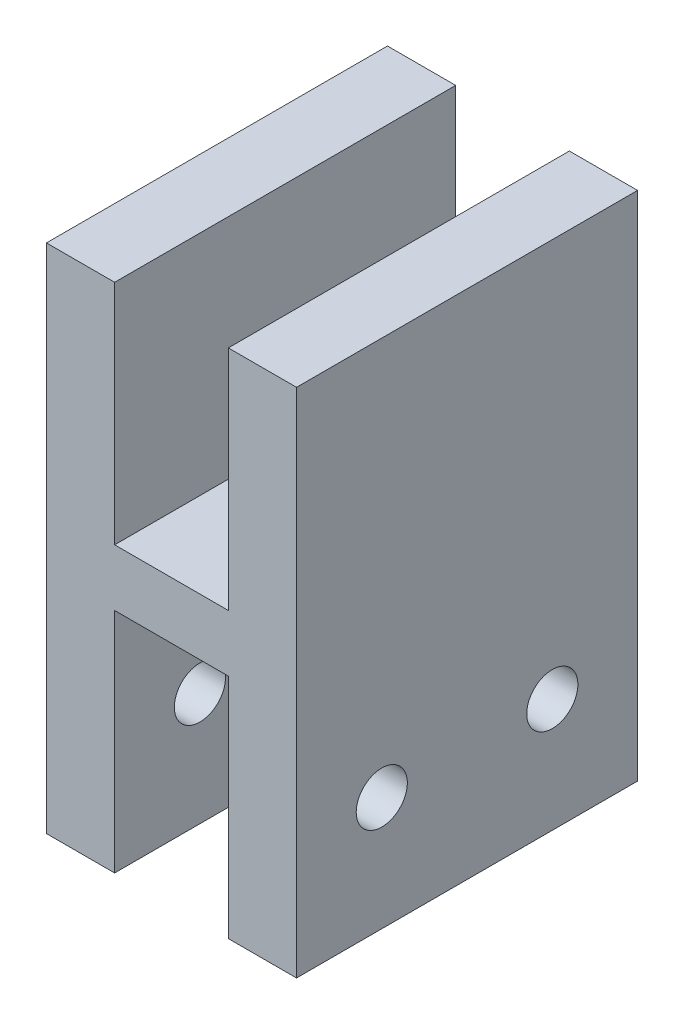
ISO-10303-21;
HEADER;
FILE_DESCRIPTION(('STEP AP214'),'2;1');
FILE_NAME('part.step','',(''),(''),'','','');
FILE_SCHEMA(('AUTOMOTIVE_DESIGN { 1 0 10303 214 1 1 1 1 }'));
ENDSEC;
DATA;
#1=APPLICATION_CONTEXT('core data for automotive mechanical design processes');
#2=APPLICATION_PROTOCOL_DEFINITION('international standard','automotive_design',2000,#1);
#3=PRODUCT_CONTEXT('',#1,'mechanical');
#4=PRODUCT('Part','Part','',(#3));
#5=PRODUCT_RELATED_PRODUCT_CATEGORY('part','',(#4));
#6=PRODUCT_DEFINITION_FORMATION('','',#4);
#7=PRODUCT_DEFINITION_CONTEXT('part definition',#1,'design');
#8=PRODUCT_DEFINITION('design','',#6,#7);
#9=PRODUCT_DEFINITION_SHAPE('','',#8);
#10=(LENGTH_UNIT() NAMED_UNIT(*) SI_UNIT(.MILLI.,.METRE.));
#11=(NAMED_UNIT(*) PLANE_ANGLE_UNIT() SI_UNIT($,.RADIAN.));
#12=(NAMED_UNIT(*) SI_UNIT($,.STERADIAN.) SOLID_ANGLE_UNIT());
#13=UNCERTAINTY_MEASURE_WITH_UNIT(LENGTH_MEASURE(1.E-05),#10,'distance_accuracy_value','');
#14=(GEOMETRIC_REPRESENTATION_CONTEXT(3) GLOBAL_UNCERTAINTY_ASSIGNED_CONTEXT((#13)) GLOBAL_UNIT_ASSIGNED_CONTEXT((#10,
#11,#12)) REPRESENTATION_CONTEXT('',''));
#15=CARTESIAN_POINT('',(0.,0.,0.));
#16=DIRECTION('',(0.,0.,1.));
#17=DIRECTION('',(1.,0.,0.));
#18=AXIS2_PLACEMENT_3D('',#15,#16,#17);
#19=CARTESIAN_POINT('',(-5.,20.,30.));
#20=DIRECTION('',(0.,-1.,0.));
#21=DIRECTION('',(1.,0.,0.));
#22=AXIS2_PLACEMENT_3D('',#19,#20,#21);
#23=PLANE('',#22);
#24=DIRECTION('',(-1.,0.,0.));
#25=VECTOR('',#24,1.);
#26=CARTESIAN_POINT('',(-5.,20.,0.));
#27=LINE('',#26,#25);
#28=CARTESIAN_POINT('',(-5.,20.,0.));
#29=VERTEX_POINT('',#28);
#30=CARTESIAN_POINT('',(-11.,20.,0.));
#31=VERTEX_POINT('',#30);
#32=EDGE_CURVE('E159',#29,#31,#27,.T.);
#33=ORIENTED_EDGE('',*,*,#32,.T.);
#34=DIRECTION('',(0.,0.,-1.));
#35=VECTOR('',#34,1.);
#36=CARTESIAN_POINT('',(-11.,20.,30.));
#37=LINE('',#36,#35);
#38=CARTESIAN_POINT('',(-11.,20.,30.));
#39=VERTEX_POINT('',#38);
#40=EDGE_CURVE('E11',#39,#31,#37,.T.);
#41=ORIENTED_EDGE('',*,*,#40,.F.);
#42=DIRECTION('',(-1.,0.,0.));
#43=VECTOR('',#42,1.);
#44=CARTESIAN_POINT('',(-5.,20.,30.));
#45=LINE('',#44,#43);
#46=CARTESIAN_POINT('',(-5.,20.,30.));
#47=VERTEX_POINT('',#46);
#48=EDGE_CURVE('E182',#47,#39,#45,.T.);
#49=ORIENTED_EDGE('',*,*,#48,.F.);
#50=DIRECTION('',(0.,0.,-1.));
#51=VECTOR('',#50,1.);
#52=CARTESIAN_POINT('',(-5.,20.,30.));
#53=LINE('',#52,#51);
#54=EDGE_CURVE('E155',#47,#29,#53,.T.);
#55=ORIENTED_EDGE('',*,*,#54,.T.);
#56=EDGE_LOOP('',(#33,#41,#49,#55));
#57=FACE_BOUND('',#56,.T.);
#58=ADVANCED_FACE('F37',(#57),#23,.F.);
#59=CARTESIAN_POINT('',(-11.,-25.,30.));
#60=DIRECTION('',(1.,0.,0.));
#61=DIRECTION('',(0.,1.,0.));
#62=AXIS2_PLACEMENT_3D('',#59,#60,#61);
#63=PLANE('',#62);
#64=CARTESIAN_POINT('',(-11.,-15.,7.5));
#65=DIRECTION('',(-1.,0.,0.));
#66=DIRECTION('',(0.,0.,1.));
#67=AXIS2_PLACEMENT_3D('',#64,#65,#66);
#68=CIRCLE('',#67,2.25);
#69=CARTESIAN_POINT('',(-11.,-15.,9.75));
#70=VERTEX_POINT('',#69);
#71=EDGE_CURVE('E456',#70,#70,#68,.T.);
#72=ORIENTED_EDGE('',*,*,#71,.F.);
#73=EDGE_LOOP('',(#72));
#74=FACE_BOUND('',#73,.T.);
#75=CARTESIAN_POINT('',(-11.,-15.,22.5));
#76=DIRECTION('',(-1.,0.,0.));
#77=DIRECTION('',(0.,0.,1.));
#78=AXIS2_PLACEMENT_3D('',#75,#76,#77);
#79=CIRCLE('',#78,2.25);
#80=CARTESIAN_POINT('',(-11.,-15.,24.75));
#81=VERTEX_POINT('',#80);
#82=EDGE_CURVE('E208',#81,#81,#79,.T.);
#83=ORIENTED_EDGE('',*,*,#82,.F.);
#84=EDGE_LOOP('',(#83));
#85=FACE_BOUND('',#84,.T.);
#86=DIRECTION('',(0.,-1.,0.));
#87=VECTOR('',#86,1.);
#88=CARTESIAN_POINT('',(-11.,-25.,0.));
#89=LINE('',#88,#87);
#90=CARTESIAN_POINT('',(-11.,-25.,0.));
#91=VERTEX_POINT('',#90);
#92=EDGE_CURVE('E162',#31,#91,#89,.T.);
#93=ORIENTED_EDGE('',*,*,#92,.T.);
#94=DIRECTION('',(0.,0.,-1.));
#95=VECTOR('',#94,1.);
#96=CARTESIAN_POINT('',(-11.,-25.,30.));
#97=LINE('',#96,#95);
#98=CARTESIAN_POINT('',(-11.,-25.,30.));
#99=VERTEX_POINT('',#98);
#100=EDGE_CURVE('E46',#99,#91,#97,.T.);
#101=ORIENTED_EDGE('',*,*,#100,.F.);
#102=DIRECTION('',(0.,-1.,0.));
#103=VECTOR('',#102,1.);
#104=CARTESIAN_POINT('',(-11.,-25.,30.));
#105=LINE('',#104,#103);
#106=EDGE_CURVE('E110',#39,#99,#105,.T.);
#107=ORIENTED_EDGE('',*,*,#106,.F.);
#108=ORIENTED_EDGE('',*,*,#40,.T.);
#109=EDGE_LOOP('',(#93,#101,#107,#108));
#110=FACE_BOUND('',#109,.T.);
#111=ADVANCED_FACE('F266',(#74,#85,#110),#63,.F.);
#112=CARTESIAN_POINT('',(-5.,-25.,30.));
#113=DIRECTION('',(0.,1.,0.));
#114=DIRECTION('',(-1.,0.,0.));
#115=AXIS2_PLACEMENT_3D('',#112,#113,#114);
#116=PLANE('',#115);
#117=DIRECTION('',(1.,0.,0.));
#118=VECTOR('',#117,1.);
#119=CARTESIAN_POINT('',(-5.,-25.,0.));
#120=LINE('',#119,#118);
#121=CARTESIAN_POINT('',(-5.,-25.,0.));
#122=VERTEX_POINT('',#121);
#123=EDGE_CURVE('E165',#91,#122,#120,.T.);
#124=ORIENTED_EDGE('',*,*,#123,.T.);
#125=DIRECTION('',(0.,0.,-1.));
#126=VECTOR('',#125,1.);
#127=CARTESIAN_POINT('',(-5.,-25.,30.));
#128=LINE('',#127,#126);
#129=CARTESIAN_POINT('',(-5.,-25.,30.));
#130=VERTEX_POINT('',#129);
#131=EDGE_CURVE('E201',#130,#122,#128,.T.);
#132=ORIENTED_EDGE('',*,*,#131,.F.);
#133=DIRECTION('',(1.,0.,0.));
#134=VECTOR('',#133,1.);
#135=CARTESIAN_POINT('',(-5.,-25.,30.));
#136=LINE('',#135,#134);
#137=EDGE_CURVE('E227',#99,#130,#136,.T.);
#138=ORIENTED_EDGE('',*,*,#137,.F.);
#139=ORIENTED_EDGE('',*,*,#100,.T.);
#140=EDGE_LOOP('',(#124,#132,#138,#139));
#141=FACE_BOUND('',#140,.T.);
#142=ADVANCED_FACE('F270',(#141),#116,.F.);
#143=CARTESIAN_POINT('',(-5.,-5.,30.));
#144=DIRECTION('',(-1.,0.,0.));
#145=DIRECTION('',(0.,-1.,0.));
#146=AXIS2_PLACEMENT_3D('',#143,#144,#145);
#147=PLANE('',#146);
#148=CARTESIAN_POINT('',(-5.,-15.,7.5));
#149=DIRECTION('',(-1.,0.,0.));
#150=DIRECTION('',(0.,-1.,0.));
#151=AXIS2_PLACEMENT_3D('',#148,#149,#150);
#152=CIRCLE('',#151,2.25);
#153=CARTESIAN_POINT('',(-5.,-17.25,7.5));
#154=VERTEX_POINT('',#153);
#155=EDGE_CURVE('E219',#154,#154,#152,.T.);
#156=ORIENTED_EDGE('',*,*,#155,.T.);
#157=EDGE_LOOP('',(#156));
#158=FACE_BOUND('',#157,.T.);
#159=CARTESIAN_POINT('',(-5.,-15.,22.5));
#160=DIRECTION('',(-1.,0.,0.));
#161=DIRECTION('',(0.,-1.,0.));
#162=AXIS2_PLACEMENT_3D('',#159,#160,#161);
#163=CIRCLE('',#162,2.25);
#164=CARTESIAN_POINT('',(-5.,-17.25,22.5));
#165=VERTEX_POINT('',#164);
#166=EDGE_CURVE('E163',#165,#165,#163,.T.);
#167=ORIENTED_EDGE('',*,*,#166,.T.);
#168=EDGE_LOOP('',(#167));
#169=FACE_BOUND('',#168,.T.);
#170=DIRECTION('',(0.,1.,0.));
#171=VECTOR('',#170,1.);
#172=CARTESIAN_POINT('',(-5.,-5.,0.));
#173=LINE('',#172,#171);
#174=CARTESIAN_POINT('',(-5.,-5.,0.));
#175=VERTEX_POINT('',#174);
#176=EDGE_CURVE('E167',#122,#175,#173,.T.);
#177=ORIENTED_EDGE('',*,*,#176,.T.);
#178=DIRECTION('',(0.,0.,-1.));
#179=VECTOR('',#178,1.);
#180=CARTESIAN_POINT('',(-5.,-5.,30.));
#181=LINE('',#180,#179);
#182=CARTESIAN_POINT('',(-5.,-5.,30.));
#183=VERTEX_POINT('',#182);
#184=EDGE_CURVE('E198',#183,#175,#181,.T.);
#185=ORIENTED_EDGE('',*,*,#184,.F.);
#186=DIRECTION('',(0.,1.,0.));
#187=VECTOR('',#186,1.);
#188=CARTESIAN_POINT('',(-5.,-5.,30.));
#189=LINE('',#188,#187);
#190=EDGE_CURVE('E229',#130,#183,#189,.T.);
#191=ORIENTED_EDGE('',*,*,#190,.F.);
#192=ORIENTED_EDGE('',*,*,#131,.T.);
#193=EDGE_LOOP('',(#177,#185,#191,#192));
#194=FACE_BOUND('',#193,.T.);
#195=ADVANCED_FACE('F275',(#158,#169,#194),#147,.F.);
#196=CARTESIAN_POINT('',(5.,-5.,30.));
#197=DIRECTION('',(0.,1.,0.));
#198=DIRECTION('',(0.,0.,1.));
#199=AXIS2_PLACEMENT_3D('',#196,#197,#198);
#200=PLANE('',#199);
#201=DIRECTION('',(1.,0.,0.));
#202=VECTOR('',#201,1.);
#203=CARTESIAN_POINT('',(5.,-5.,0.));
#204=LINE('',#203,#202);
#205=CARTESIAN_POINT('',(5.,-5.,0.));
#206=VERTEX_POINT('',#205);
#207=EDGE_CURVE('E169',#175,#206,#204,.T.);
#208=ORIENTED_EDGE('',*,*,#207,.T.);
#209=DIRECTION('',(0.,0.,-1.));
#210=VECTOR('',#209,1.);
#211=CARTESIAN_POINT('',(5.,-5.,30.));
#212=LINE('',#211,#210);
#213=CARTESIAN_POINT('',(5.,-5.,30.));
#214=VERTEX_POINT('',#213);
#215=EDGE_CURVE('E195',#214,#206,#212,.T.);
#216=ORIENTED_EDGE('',*,*,#215,.F.);
#217=DIRECTION('',(1.,0.,0.));
#218=VECTOR('',#217,1.);
#219=CARTESIAN_POINT('',(5.,-5.,30.));
#220=LINE('',#219,#218);
#221=EDGE_CURVE('E231',#183,#214,#220,.T.);
#222=ORIENTED_EDGE('',*,*,#221,.F.);
#223=ORIENTED_EDGE('',*,*,#184,.T.);
#224=EDGE_LOOP('',(#208,#216,#222,#223));
#225=FACE_BOUND('',#224,.T.);
#226=ADVANCED_FACE('F283',(#225),#200,.F.);
#227=CARTESIAN_POINT('',(5.,-25.,30.));
#228=DIRECTION('',(1.,0.,0.));
#229=DIRECTION('',(0.,1.,0.));
#230=AXIS2_PLACEMENT_3D('',#227,#228,#229);
#231=PLANE('',#230);
#232=CARTESIAN_POINT('',(5.,-15.,7.5));
#233=DIRECTION('',(1.,0.,0.));
#234=DIRECTION('',(0.,1.,0.));
#235=AXIS2_PLACEMENT_3D('',#232,#233,#234);
#236=CIRCLE('',#235,2.25);
#237=CARTESIAN_POINT('',(5.,-12.75,7.5));
#238=VERTEX_POINT('',#237);
#239=EDGE_CURVE('E214',#238,#238,#236,.T.);
#240=ORIENTED_EDGE('',*,*,#239,.T.);
#241=EDGE_LOOP('',(#240));
#242=FACE_BOUND('',#241,.T.);
#243=CARTESIAN_POINT('',(5.,-15.,22.5));
#244=DIRECTION('',(1.,0.,0.));
#245=DIRECTION('',(0.,1.,0.));
#246=AXIS2_PLACEMENT_3D('',#243,#244,#245);
#247=CIRCLE('',#246,2.25);
#248=CARTESIAN_POINT('',(5.,-12.75,22.5));
#249=VERTEX_POINT('',#248);
#250=EDGE_CURVE('E205',#249,#249,#247,.T.);
#251=ORIENTED_EDGE('',*,*,#250,.T.);
#252=EDGE_LOOP('',(#251));
#253=FACE_BOUND('',#252,.T.);
#254=DIRECTION('',(0.,-1.,0.));
#255=VECTOR('',#254,1.);
#256=CARTESIAN_POINT('',(5.,-25.,0.));
#257=LINE('',#256,#255);
#258=CARTESIAN_POINT('',(5.,-25.,0.));
#259=VERTEX_POINT('',#258);
#260=EDGE_CURVE('E171',#206,#259,#257,.T.);
#261=ORIENTED_EDGE('',*,*,#260,.T.);
#262=DIRECTION('',(0.,0.,-1.));
#263=VECTOR('',#262,1.);
#264=CARTESIAN_POINT('',(5.,-25.,30.));
#265=LINE('',#264,#263);
#266=CARTESIAN_POINT('',(5.,-25.,30.));
#267=VERTEX_POINT('',#266);
#268=EDGE_CURVE('E192',#267,#259,#265,.T.);
#269=ORIENTED_EDGE('',*,*,#268,.F.);
#270=DIRECTION('',(0.,-1.,0.));
#271=VECTOR('',#270,1.);
#272=CARTESIAN_POINT('',(5.,-25.,30.));
#273=LINE('',#272,#271);
#274=EDGE_CURVE('E233',#214,#267,#273,.T.);
#275=ORIENTED_EDGE('',*,*,#274,.F.);
#276=ORIENTED_EDGE('',*,*,#215,.T.);
#277=EDGE_LOOP('',(#261,#269,#275,#276));
#278=FACE_BOUND('',#277,.T.);
#279=ADVANCED_FACE('F287',(#242,#253,#278),#231,.F.);
#280=CARTESIAN_POINT('',(11.,-25.,30.));
#281=DIRECTION('',(0.,1.,0.));
#282=DIRECTION('',(-1.,0.,0.));
#283=AXIS2_PLACEMENT_3D('',#280,#281,#282);
#284=PLANE('',#283);
#285=DIRECTION('',(1.,0.,0.));
#286=VECTOR('',#285,1.);
#287=CARTESIAN_POINT('',(11.,-25.,0.));
#288=LINE('',#287,#286);
#289=CARTESIAN_POINT('',(11.,-25.,0.));
#290=VERTEX_POINT('',#289);
#291=EDGE_CURVE('E173',#259,#290,#288,.T.);
#292=ORIENTED_EDGE('',*,*,#291,.T.);
#293=DIRECTION('',(0.,0.,-1.));
#294=VECTOR('',#293,1.);
#295=CARTESIAN_POINT('',(11.,-25.,30.));
#296=LINE('',#295,#294);
#297=CARTESIAN_POINT('',(11.,-25.,30.));
#298=VERTEX_POINT('',#297);
#299=EDGE_CURVE('E189',#298,#290,#296,.T.);
#300=ORIENTED_EDGE('',*,*,#299,.F.);
#301=DIRECTION('',(1.,0.,0.));
#302=VECTOR('',#301,1.);
#303=CARTESIAN_POINT('',(11.,-25.,30.));
#304=LINE('',#303,#302);
#305=EDGE_CURVE('E235',#267,#298,#304,.T.);
#306=ORIENTED_EDGE('',*,*,#305,.F.);
#307=ORIENTED_EDGE('',*,*,#268,.T.);
#308=EDGE_LOOP('',(#292,#300,#306,#307));
#309=FACE_BOUND('',#308,.T.);
#310=ADVANCED_FACE('F291',(#309),#284,.F.);
#311=CARTESIAN_POINT('',(11.,-25.,30.));
#312=DIRECTION('',(-1.,0.,0.));
#313=DIRECTION('',(0.,-1.,0.));
#314=AXIS2_PLACEMENT_3D('',#311,#312,#313);
#315=PLANE('',#314);
#316=CARTESIAN_POINT('',(11.,-15.,7.5));
#317=DIRECTION('',(-1.,0.,0.));
#318=DIRECTION('',(0.,-1.,0.));
#319=AXIS2_PLACEMENT_3D('',#316,#317,#318);
#320=CIRCLE('',#319,2.25);
#321=CARTESIAN_POINT('',(11.,-17.25,7.5));
#322=VERTEX_POINT('',#321);
#323=EDGE_CURVE('E40',#322,#322,#320,.T.);
#324=ORIENTED_EDGE('',*,*,#323,.T.);
#325=EDGE_LOOP('',(#324));
#326=FACE_BOUND('',#325,.T.);
#327=CARTESIAN_POINT('',(11.,-15.,22.5));
#328=DIRECTION('',(-1.,0.,0.));
#329=DIRECTION('',(0.,-1.,0.));
#330=AXIS2_PLACEMENT_3D('',#327,#328,#329);
#331=CIRCLE('',#330,2.25);
#332=CARTESIAN_POINT('',(11.,-17.25,22.5));
#333=VERTEX_POINT('',#332);
#334=EDGE_CURVE('E207',#333,#333,#331,.T.);
#335=ORIENTED_EDGE('',*,*,#334,.T.);
#336=EDGE_LOOP('',(#335));
#337=FACE_BOUND('',#336,.T.);
#338=DIRECTION('',(0.,1.,0.));
#339=VECTOR('',#338,1.);
#340=CARTESIAN_POINT('',(11.,-25.,0.));
#341=LINE('',#340,#339);
#342=CARTESIAN_POINT('',(11.,20.,0.));
#343=VERTEX_POINT('',#342);
#344=EDGE_CURVE('E175',#290,#343,#341,.T.);
#345=ORIENTED_EDGE('',*,*,#344,.T.);
#346=DIRECTION('',(0.,0.,-1.));
#347=VECTOR('',#346,1.);
#348=CARTESIAN_POINT('',(11.,20.,30.));
#349=LINE('',#348,#347);
#350=CARTESIAN_POINT('',(11.,20.,30.));
#351=VERTEX_POINT('',#350);
#352=EDGE_CURVE('E186',#351,#343,#349,.T.);
#353=ORIENTED_EDGE('',*,*,#352,.F.);
#354=DIRECTION('',(0.,1.,0.));
#355=VECTOR('',#354,1.);
#356=CARTESIAN_POINT('',(11.,-25.,30.));
#357=LINE('',#356,#355);
#358=EDGE_CURVE('E237',#298,#351,#357,.T.);
#359=ORIENTED_EDGE('',*,*,#358,.F.);
#360=ORIENTED_EDGE('',*,*,#299,.T.);
#361=EDGE_LOOP('',(#345,#353,#359,#360));
#362=FACE_BOUND('',#361,.T.);
#363=ADVANCED_FACE('F243',(#326,#337,#362),#315,.F.);
#364=CARTESIAN_POINT('',(11.,20.,30.));
#365=DIRECTION('',(0.,-1.,0.));
#366=DIRECTION('',(1.,0.,0.));
#367=AXIS2_PLACEMENT_3D('',#364,#365,#366);
#368=PLANE('',#367);
#369=DIRECTION('',(-1.,0.,0.));
#370=VECTOR('',#369,1.);
#371=CARTESIAN_POINT('',(11.,20.,0.));
#372=LINE('',#371,#370);
#373=CARTESIAN_POINT('',(5.,20.,0.));
#374=VERTEX_POINT('',#373);
#375=EDGE_CURVE('E177',#343,#374,#372,.T.);
#376=ORIENTED_EDGE('',*,*,#375,.T.);
#377=DIRECTION('',(0.,0.,-1.));
#378=VECTOR('',#377,1.);
#379=CARTESIAN_POINT('',(5.,20.,30.));
#380=LINE('',#379,#378);
#381=CARTESIAN_POINT('',(5.,20.,30.));
#382=VERTEX_POINT('',#381);
#383=EDGE_CURVE('E150',#382,#374,#380,.T.);
#384=ORIENTED_EDGE('',*,*,#383,.F.);
#385=DIRECTION('',(-1.,0.,0.));
#386=VECTOR('',#385,1.);
#387=CARTESIAN_POINT('',(11.,20.,30.));
#388=LINE('',#387,#386);
#389=EDGE_CURVE('E141',#351,#382,#388,.T.);
#390=ORIENTED_EDGE('',*,*,#389,.F.);
#391=ORIENTED_EDGE('',*,*,#352,.T.);
#392=EDGE_LOOP('',(#376,#384,#390,#391));
#393=FACE_BOUND('',#392,.T.);
#394=ADVANCED_FACE('F247',(#393),#368,.F.);
#395=CARTESIAN_POINT('',(5.,20.,30.));
#396=DIRECTION('',(1.,0.,0.));
#397=DIRECTION('',(0.,1.,0.));
#398=AXIS2_PLACEMENT_3D('',#395,#396,#397);
#399=PLANE('',#398);
#400=DIRECTION('',(0.,-1.,0.));
#401=VECTOR('',#400,1.);
#402=CARTESIAN_POINT('',(5.,20.,0.));
#403=LINE('',#402,#401);
#404=CARTESIAN_POINT('',(5.,0.,0.));
#405=VERTEX_POINT('',#404);
#406=EDGE_CURVE('E149',#374,#405,#403,.T.);
#407=ORIENTED_EDGE('',*,*,#406,.T.);
#408=DIRECTION('',(0.,0.,-1.));
#409=VECTOR('',#408,1.);
#410=CARTESIAN_POINT('',(5.,0.,30.));
#411=LINE('',#410,#409);
#412=CARTESIAN_POINT('',(5.,0.,30.));
#413=VERTEX_POINT('',#412);
#414=EDGE_CURVE('E146',#413,#405,#411,.T.);
#415=ORIENTED_EDGE('',*,*,#414,.F.);
#416=DIRECTION('',(0.,-1.,0.));
#417=VECTOR('',#416,1.);
#418=CARTESIAN_POINT('',(5.,20.,30.));
#419=LINE('',#418,#417);
#420=EDGE_CURVE('E135',#382,#413,#419,.T.);
#421=ORIENTED_EDGE('',*,*,#420,.F.);
#422=ORIENTED_EDGE('',*,*,#383,.T.);
#423=EDGE_LOOP('',(#407,#415,#421,#422));
#424=FACE_BOUND('',#423,.T.);
#425=ADVANCED_FACE('F147',(#424),#399,.F.);
#426=CARTESIAN_POINT('',(5.,0.,30.));
#427=DIRECTION('',(0.,-1.,0.));
#428=DIRECTION('',(0.,0.,-1.));
#429=AXIS2_PLACEMENT_3D('',#426,#427,#428);
#430=PLANE('',#429);
#431=DIRECTION('',(-1.,0.,0.));
#432=VECTOR('',#431,1.);
#433=CARTESIAN_POINT('',(5.,0.,0.));
#434=LINE('',#433,#432);
#435=CARTESIAN_POINT('',(-5.,0.,0.));
#436=VERTEX_POINT('',#435);
#437=EDGE_CURVE('E96',#405,#436,#434,.T.);
#438=ORIENTED_EDGE('',*,*,#437,.T.);
#439=DIRECTION('',(0.,0.,-1.));
#440=VECTOR('',#439,1.);
#441=CARTESIAN_POINT('',(-5.,0.,30.));
#442=LINE('',#441,#440);
#443=CARTESIAN_POINT('',(-5.,0.,30.));
#444=VERTEX_POINT('',#443);
#445=EDGE_CURVE('E151',#444,#436,#442,.T.);
#446=ORIENTED_EDGE('',*,*,#445,.F.);
#447=DIRECTION('',(-1.,0.,0.));
#448=VECTOR('',#447,1.);
#449=CARTESIAN_POINT('',(5.,0.,30.));
#450=LINE('',#449,#448);
#451=EDGE_CURVE('E139',#413,#444,#450,.T.);
#452=ORIENTED_EDGE('',*,*,#451,.F.);
#453=ORIENTED_EDGE('',*,*,#414,.T.);
#454=EDGE_LOOP('',(#438,#446,#452,#453));
#455=FACE_BOUND('',#454,.T.);
#456=ADVANCED_FACE('F153',(#455),#430,.F.);
#457=CARTESIAN_POINT('',(-5.,0.,30.));
#458=DIRECTION('',(-1.,0.,0.));
#459=DIRECTION('',(0.,-1.,0.));
#460=AXIS2_PLACEMENT_3D('',#457,#458,#459);
#461=PLANE('',#460);
#462=DIRECTION('',(0.,1.,0.));
#463=VECTOR('',#462,1.);
#464=CARTESIAN_POINT('',(-5.,0.,0.));
#465=LINE('',#464,#463);
#466=EDGE_CURVE('E102',#436,#29,#465,.T.);
#467=ORIENTED_EDGE('',*,*,#466,.T.);
#468=ORIENTED_EDGE('',*,*,#54,.F.);
#469=DIRECTION('',(0.,1.,0.));
#470=VECTOR('',#469,1.);
#471=CARTESIAN_POINT('',(-5.,0.,30.));
#472=LINE('',#471,#470);
#473=EDGE_CURVE('E55',#444,#47,#472,.T.);
#474=ORIENTED_EDGE('',*,*,#473,.F.);
#475=ORIENTED_EDGE('',*,*,#445,.T.);
#476=EDGE_LOOP('',(#467,#468,#474,#475));
#477=FACE_BOUND('',#476,.T.);
#478=ADVANCED_FACE('F255',(#477),#461,.F.);
#479=CARTESIAN_POINT('',(0.,0.,30.));
#480=DIRECTION('',(0.,0.,-1.));
#481=DIRECTION('',(-1.,0.,0.));
#482=AXIS2_PLACEMENT_3D('',#479,#480,#481);
#483=PLANE('',#482);
#484=ORIENTED_EDGE('',*,*,#48,.T.);
#485=ORIENTED_EDGE('',*,*,#106,.T.);
#486=ORIENTED_EDGE('',*,*,#137,.T.);
#487=ORIENTED_EDGE('',*,*,#190,.T.);
#488=ORIENTED_EDGE('',*,*,#221,.T.);
#489=ORIENTED_EDGE('',*,*,#274,.T.);
#490=ORIENTED_EDGE('',*,*,#305,.T.);
#491=ORIENTED_EDGE('',*,*,#358,.T.);
#492=ORIENTED_EDGE('',*,*,#389,.T.);
#493=ORIENTED_EDGE('',*,*,#420,.T.);
#494=ORIENTED_EDGE('',*,*,#451,.T.);
#495=ORIENTED_EDGE('',*,*,#473,.T.);
#496=EDGE_LOOP('',(#484,#485,#486,#487,#488,#489,#490,#491,#492,#493,#494,#495));
#497=FACE_BOUND('',#496,.T.);
#498=ADVANCED_FACE('F137',(#497),#483,.F.);
#499=CARTESIAN_POINT('',(0.,0.,0.));
#500=DIRECTION('',(0.,0.,-1.));
#501=DIRECTION('',(-1.,0.,0.));
#502=AXIS2_PLACEMENT_3D('',#499,#500,#501);
#503=PLANE('',#502);
#504=ORIENTED_EDGE('',*,*,#32,.F.);
#505=ORIENTED_EDGE('',*,*,#466,.F.);
#506=ORIENTED_EDGE('',*,*,#437,.F.);
#507=ORIENTED_EDGE('',*,*,#406,.F.);
#508=ORIENTED_EDGE('',*,*,#375,.F.);
#509=ORIENTED_EDGE('',*,*,#344,.F.);
#510=ORIENTED_EDGE('',*,*,#291,.F.);
#511=ORIENTED_EDGE('',*,*,#260,.F.);
#512=ORIENTED_EDGE('',*,*,#207,.F.);
#513=ORIENTED_EDGE('',*,*,#176,.F.);
#514=ORIENTED_EDGE('',*,*,#123,.F.);
#515=ORIENTED_EDGE('',*,*,#92,.F.);
#516=EDGE_LOOP('',(#504,#505,#506,#507,#508,#509,#510,#511,#512,#513,#514,#515));
#517=FACE_BOUND('',#516,.T.);
#518=ADVANCED_FACE('F250',(#517),#503,.T.);
#519=CARTESIAN_POINT('',(-11.,-15.,22.5));
#520=DIRECTION('',(-1.,0.,0.));
#521=DIRECTION('',(0.,0.,1.));
#522=AXIS2_PLACEMENT_3D('',#519,#520,#521);
#523=CYLINDRICAL_SURFACE('',#522,2.25);
#524=ORIENTED_EDGE('',*,*,#250,.F.);
#525=EDGE_LOOP('',(#524));
#526=FACE_BOUND('',#525,.T.);
#527=ORIENTED_EDGE('',*,*,#334,.F.);
#528=EDGE_LOOP('',(#527));
#529=FACE_BOUND('',#528,.T.);
#530=ADVANCED_FACE('F331',(#526,#529),#523,.F.);
#531=ORIENTED_EDGE('',*,*,#82,.T.);
#532=EDGE_LOOP('',(#531));
#533=FACE_BOUND('',#532,.T.);
#534=ORIENTED_EDGE('',*,*,#166,.F.);
#535=EDGE_LOOP('',(#534));
#536=FACE_BOUND('',#535,.T.);
#537=ADVANCED_FACE('F372',(#533,#536),#523,.F.);
#538=CARTESIAN_POINT('',(-11.,-15.,7.5));
#539=DIRECTION('',(-1.,0.,0.));
#540=DIRECTION('',(0.,0.,1.));
#541=AXIS2_PLACEMENT_3D('',#538,#539,#540);
#542=CYLINDRICAL_SURFACE('',#541,2.25);
#543=ORIENTED_EDGE('',*,*,#323,.F.);
#544=EDGE_LOOP('',(#543));
#545=FACE_BOUND('',#544,.T.);
#546=ORIENTED_EDGE('',*,*,#239,.F.);
#547=EDGE_LOOP('',(#546));
#548=FACE_BOUND('',#547,.T.);
#549=ADVANCED_FACE('F383',(#545,#548),#542,.F.);
#550=ORIENTED_EDGE('',*,*,#71,.T.);
#551=EDGE_LOOP('',(#550));
#552=FACE_BOUND('',#551,.T.);
#553=ORIENTED_EDGE('',*,*,#155,.F.);
#554=EDGE_LOOP('',(#553));
#555=FACE_BOUND('',#554,.T.);
#556=ADVANCED_FACE('F392',(#552,#555),#542,.F.);
#557=CLOSED_SHELL('',(#58,#111,#142,#195,#226,#279,#310,#363,#394,#425,#456,#478,#498,#518,#530,
#537,#549,#556));
#558=MANIFOLD_SOLID_BREP('B2',#557);
#559=ADVANCED_BREP_SHAPE_REPRESENTATION('',(#18,#558),#14);
#560=SHAPE_DEFINITION_REPRESENTATION(#9,#559);
ENDSEC;
END-ISO-10303-21;
